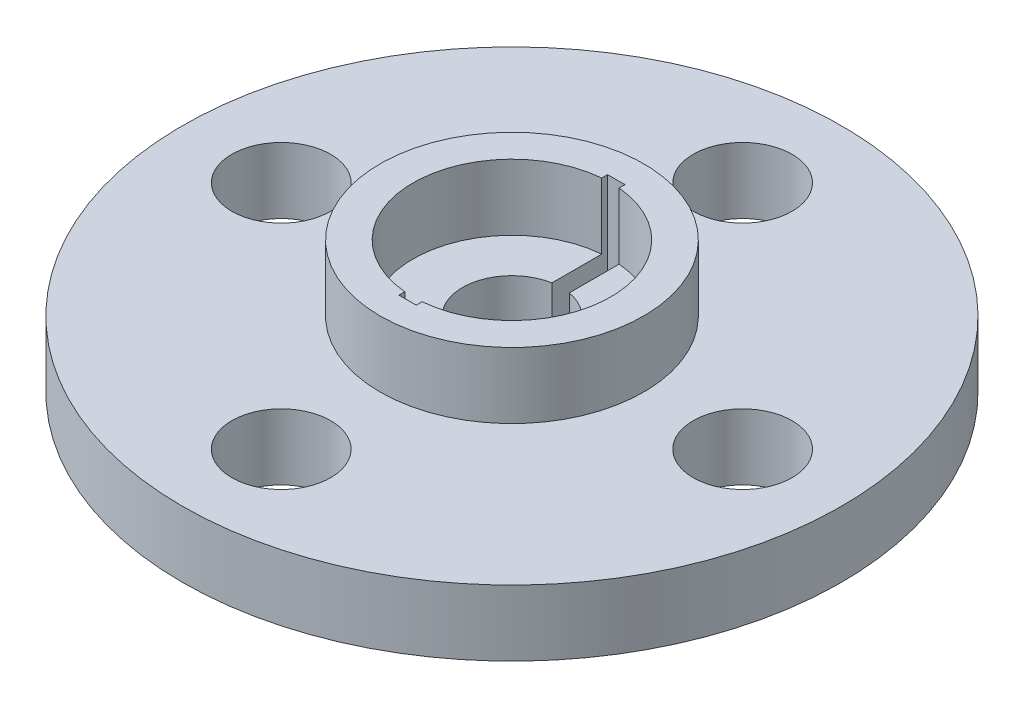
ISO-10303-21;
HEADER;
FILE_DESCRIPTION(('STEP AP214'),'2;1');
FILE_NAME('part.step','',(''),(''),'','','');
FILE_SCHEMA(('AUTOMOTIVE_DESIGN { 1 0 10303 214 1 1 1 1 }'));
ENDSEC;
DATA;
#1=APPLICATION_CONTEXT('core data for automotive mechanical design processes');
#2=APPLICATION_PROTOCOL_DEFINITION('international standard','automotive_design',2000,#1);
#3=PRODUCT_CONTEXT('',#1,'mechanical');
#4=PRODUCT('Part','Part','',(#3));
#5=PRODUCT_RELATED_PRODUCT_CATEGORY('part','',(#4));
#6=PRODUCT_DEFINITION_FORMATION('','',#4);
#7=PRODUCT_DEFINITION_CONTEXT('part definition',#1,'design');
#8=PRODUCT_DEFINITION('design','',#6,#7);
#9=PRODUCT_DEFINITION_SHAPE('','',#8);
#10=(LENGTH_UNIT() NAMED_UNIT(*) SI_UNIT(.MILLI.,.METRE.));
#11=(NAMED_UNIT(*) PLANE_ANGLE_UNIT() SI_UNIT($,.RADIAN.));
#12=(NAMED_UNIT(*) SI_UNIT($,.STERADIAN.) SOLID_ANGLE_UNIT());
#13=UNCERTAINTY_MEASURE_WITH_UNIT(LENGTH_MEASURE(1.E-05),#10,'distance_accuracy_value','');
#14=(GEOMETRIC_REPRESENTATION_CONTEXT(3) GLOBAL_UNCERTAINTY_ASSIGNED_CONTEXT((#13)) GLOBAL_UNIT_ASSIGNED_CONTEXT((#10,
#11,#12)) REPRESENTATION_CONTEXT('',''));
#15=CARTESIAN_POINT('',(0.,0.,0.));
#16=DIRECTION('',(0.,0.,1.));
#17=DIRECTION('',(1.,0.,0.));
#18=AXIS2_PLACEMENT_3D('',#15,#16,#17);
#19=CARTESIAN_POINT('',(0.,2.,0.));
#20=DIRECTION('',(0.,1.,0.));
#21=DIRECTION('',(0.,0.,1.));
#22=AXIS2_PLACEMENT_3D('',#19,#20,#21);
#23=PLANE('',#22);
#24=DIRECTION('',(0.,0.,-1.));
#25=VECTOR('',#24,1.);
#26=CARTESIAN_POINT('',(0.263212747721654,2.,0.));
#27=LINE('',#26,#25);
#28=CARTESIAN_POINT('',(0.263212747721654,2.,2.98843086743475));
#29=VERTEX_POINT('',#28);
#30=CARTESIAN_POINT('',(0.263212747721654,2.,1.47672578681244));
#31=VERTEX_POINT('',#30);
#32=EDGE_CURVE('E188',#29,#31,#27,.T.);
#33=ORIENTED_EDGE('',*,*,#32,.F.);
#34=CARTESIAN_POINT('',(0.,2.,0.));
#35=DIRECTION('',(0.,1.,0.));
#36=DIRECTION('',(0.,0.,1.));
#37=AXIS2_PLACEMENT_3D('',#34,#35,#36);
#38=CIRCLE('',#37,3.);
#39=CARTESIAN_POINT('',(0.263212747721654,2.,-2.98843086743475));
#40=VERTEX_POINT('',#39);
#41=EDGE_CURVE('E236',#40,#29,#38,.F.);
#42=ORIENTED_EDGE('',*,*,#41,.F.);
#43=CARTESIAN_POINT('',(0.263212747721654,2.,-1.47672578681244));
#44=VERTEX_POINT('',#43);
#45=EDGE_CURVE('E185',#44,#40,#27,.T.);
#46=ORIENTED_EDGE('',*,*,#45,.F.);
#47=CARTESIAN_POINT('',(0.,2.,0.));
#48=DIRECTION('',(0.,1.,0.));
#49=DIRECTION('',(0.,0.,1.));
#50=AXIS2_PLACEMENT_3D('',#47,#48,#49);
#51=CIRCLE('',#50,1.5);
#52=EDGE_CURVE('E219',#31,#44,#51,.T.);
#53=ORIENTED_EDGE('',*,*,#52,.F.);
#54=EDGE_LOOP('',(#33,#42,#46,#53));
#55=FACE_BOUND('',#54,.T.);
#56=ADVANCED_FACE('F42',(#55),#23,.T.);
#57=CARTESIAN_POINT('',(0.,2.,0.));
#58=DIRECTION('',(0.,-1.,0.));
#59=DIRECTION('',(0.,0.,-1.));
#60=AXIS2_PLACEMENT_3D('',#57,#58,#59);
#61=CYLINDRICAL_SURFACE('',#60,1.5);
#62=DIRECTION('',(0.,-1.,0.));
#63=VECTOR('',#62,1.);
#64=CARTESIAN_POINT('',(0.263212747721654,2.,1.47672578681244));
#65=LINE('',#64,#63);
#66=CARTESIAN_POINT('',(0.263212747721654,0.,1.47672578681244));
#67=VERTEX_POINT('',#66);
#68=EDGE_CURVE('E190',#31,#67,#65,.T.);
#69=ORIENTED_EDGE('',*,*,#68,.F.);
#70=ORIENTED_EDGE('',*,*,#52,.T.);
#71=DIRECTION('',(0.,-1.,0.));
#72=VECTOR('',#71,1.);
#73=CARTESIAN_POINT('',(0.263212747721654,2.,-1.47672578681244));
#74=LINE('',#73,#72);
#75=CARTESIAN_POINT('',(0.263212747721654,0.,-1.47672578681244));
#76=VERTEX_POINT('',#75);
#77=EDGE_CURVE('E187',#76,#44,#74,.F.);
#78=ORIENTED_EDGE('',*,*,#77,.F.);
#79=CARTESIAN_POINT('',(0.,0.,0.));
#80=DIRECTION('',(0.,1.,0.));
#81=DIRECTION('',(0.,0.,1.));
#82=AXIS2_PLACEMENT_3D('',#79,#80,#81);
#83=CIRCLE('',#82,1.5);
#84=EDGE_CURVE('E224',#67,#76,#83,.T.);
#85=ORIENTED_EDGE('',*,*,#84,.F.);
#86=EDGE_LOOP('',(#69,#70,#78,#85));
#87=FACE_BOUND('',#86,.T.);
#88=ADVANCED_FACE('F261',(#87),#61,.F.);
#89=CARTESIAN_POINT('',(0.,4.,0.));
#90=DIRECTION('',(0.,-1.,0.));
#91=DIRECTION('',(0.,0.,-1.));
#92=AXIS2_PLACEMENT_3D('',#89,#90,#91);
#93=CYLINDRICAL_SURFACE('',#92,3.);
#94=DIRECTION('',(0.,-1.,0.));
#95=VECTOR('',#94,1.);
#96=CARTESIAN_POINT('',(0.263212747721654,4.,2.98843086743475));
#97=LINE('',#96,#95);
#98=CARTESIAN_POINT('',(0.263212747721654,4.,2.98843086743475));
#99=VERTEX_POINT('',#98);
#100=EDGE_CURVE('E11',#99,#29,#97,.T.);
#101=ORIENTED_EDGE('',*,*,#100,.F.);
#102=CARTESIAN_POINT('',(0.,4.,0.));
#103=DIRECTION('',(0.,1.,0.));
#104=DIRECTION('',(0.,0.,1.));
#105=AXIS2_PLACEMENT_3D('',#102,#103,#104);
#106=CIRCLE('',#105,3.);
#107=CARTESIAN_POINT('',(0.263212747721654,4.,-2.98843086743475));
#108=VERTEX_POINT('',#107);
#109=EDGE_CURVE('E156',#99,#108,#106,.T.);
#110=ORIENTED_EDGE('',*,*,#109,.T.);
#111=DIRECTION('',(0.,-1.,0.));
#112=VECTOR('',#111,1.);
#113=CARTESIAN_POINT('',(0.263212747721654,4.,-2.98843086743475));
#114=LINE('',#113,#112);
#115=EDGE_CURVE('E50',#40,#108,#114,.F.);
#116=ORIENTED_EDGE('',*,*,#115,.F.);
#117=ORIENTED_EDGE('',*,*,#41,.T.);
#118=EDGE_LOOP('',(#101,#110,#116,#117));
#119=FACE_BOUND('',#118,.T.);
#120=ADVANCED_FACE('F254',(#119),#93,.F.);
#121=DIRECTION('',(0.,0.,1.));
#122=VECTOR('',#121,1.);
#123=CARTESIAN_POINT('',(-0.263212747721654,2.,0.));
#124=LINE('',#123,#122);
#125=CARTESIAN_POINT('',(-0.263212747721654,2.,-2.98843086743475));
#126=VERTEX_POINT('',#125);
#127=CARTESIAN_POINT('',(-0.263212747721654,2.,-1.47672578681244));
#128=VERTEX_POINT('',#127);
#129=EDGE_CURVE('E181',#126,#128,#124,.T.);
#130=ORIENTED_EDGE('',*,*,#129,.F.);
#131=CARTESIAN_POINT('',(-0.263212747721654,2.,2.98843086743475));
#132=VERTEX_POINT('',#131);
#133=EDGE_CURVE('E239',#132,#126,#38,.F.);
#134=ORIENTED_EDGE('',*,*,#133,.F.);
#135=CARTESIAN_POINT('',(-0.263212747721654,2.,1.47672578681244));
#136=VERTEX_POINT('',#135);
#137=EDGE_CURVE('E57',#136,#132,#124,.T.);
#138=ORIENTED_EDGE('',*,*,#137,.F.);
#139=EDGE_CURVE('E223',#128,#136,#51,.T.);
#140=ORIENTED_EDGE('',*,*,#139,.F.);
#141=EDGE_LOOP('',(#130,#134,#138,#140));
#142=FACE_BOUND('',#141,.T.);
#143=ADVANCED_FACE('F280',(#142),#23,.T.);
#144=CARTESIAN_POINT('',(0.,2.,0.));
#145=DIRECTION('',(0.,1.,0.));
#146=DIRECTION('',(0.,0.,1.));
#147=AXIS2_PLACEMENT_3D('',#144,#145,#146);
#148=CIRCLE('',#147,4.);
#149=CARTESIAN_POINT('',(0.,2.,4.));
#150=VERTEX_POINT('',#149);
#151=EDGE_CURVE('E194',#150,#150,#148,.T.);
#152=ORIENTED_EDGE('',*,*,#151,.F.);
#153=EDGE_LOOP('',(#152));
#154=FACE_BOUND('',#153,.T.);
#155=CARTESIAN_POINT('',(-7.,2.,0.));
#156=DIRECTION('',(0.,1.,0.));
#157=DIRECTION('',(0.,0.,1.));
#158=AXIS2_PLACEMENT_3D('',#155,#156,#157);
#159=CIRCLE('',#158,1.5);
#160=CARTESIAN_POINT('',(-7.,2.,1.49999999999995));
#161=VERTEX_POINT('',#160);
#162=EDGE_CURVE('E207',#161,#161,#159,.T.);
#163=ORIENTED_EDGE('',*,*,#162,.F.);
#164=EDGE_LOOP('',(#163));
#165=FACE_BOUND('',#164,.T.);
#166=CARTESIAN_POINT('',(0.,2.,0.));
#167=DIRECTION('',(0.,1.,0.));
#168=DIRECTION('',(0.,0.,1.));
#169=AXIS2_PLACEMENT_3D('',#166,#167,#168);
#170=CIRCLE('',#169,10.);
#171=CARTESIAN_POINT('',(0.,2.,10.));
#172=VERTEX_POINT('',#171);
#173=EDGE_CURVE('E233',#172,#172,#170,.T.);
#174=ORIENTED_EDGE('',*,*,#173,.T.);
#175=EDGE_LOOP('',(#174));
#176=FACE_BOUND('',#175,.T.);
#177=CARTESIAN_POINT('',(7.,2.,0.));
#178=DIRECTION('',(0.,1.,0.));
#179=DIRECTION('',(0.,0.,1.));
#180=AXIS2_PLACEMENT_3D('',#177,#178,#179);
#181=CIRCLE('',#180,1.5);
#182=CARTESIAN_POINT('',(7.,2.,1.5));
#183=VERTEX_POINT('',#182);
#184=EDGE_CURVE('E227',#183,#183,#181,.T.);
#185=ORIENTED_EDGE('',*,*,#184,.F.);
#186=EDGE_LOOP('',(#185));
#187=FACE_BOUND('',#186,.T.);
#188=CARTESIAN_POINT('',(0.,2.,7.));
#189=DIRECTION('',(0.,1.,0.));
#190=DIRECTION('',(0.,0.,1.));
#191=AXIS2_PLACEMENT_3D('',#188,#189,#190);
#192=CIRCLE('',#191,1.5);
#193=CARTESIAN_POINT('',(0.,2.,8.5));
#194=VERTEX_POINT('',#193);
#195=EDGE_CURVE('E213',#194,#194,#192,.T.);
#196=ORIENTED_EDGE('',*,*,#195,.F.);
#197=EDGE_LOOP('',(#196));
#198=FACE_BOUND('',#197,.T.);
#199=CARTESIAN_POINT('',(0.,2.,-7.));
#200=DIRECTION('',(0.,1.,0.));
#201=DIRECTION('',(0.,0.,1.));
#202=AXIS2_PLACEMENT_3D('',#199,#200,#201);
#203=CIRCLE('',#202,1.5);
#204=CARTESIAN_POINT('',(0.,2.,-5.5));
#205=VERTEX_POINT('',#204);
#206=EDGE_CURVE('E201',#205,#205,#203,.T.);
#207=ORIENTED_EDGE('',*,*,#206,.F.);
#208=EDGE_LOOP('',(#207));
#209=FACE_BOUND('',#208,.T.);
#210=ADVANCED_FACE('F299',(#154,#165,#176,#187,#198,#209),#23,.T.);
#211=CARTESIAN_POINT('',(0.,0.,0.));
#212=DIRECTION('',(0.,1.,0.));
#213=DIRECTION('',(0.,0.,1.));
#214=AXIS2_PLACEMENT_3D('',#211,#212,#213);
#215=PLANE('',#214);
#216=CARTESIAN_POINT('',(0.,0.,0.));
#217=DIRECTION('',(0.,1.,0.));
#218=DIRECTION('',(0.,0.,1.));
#219=AXIS2_PLACEMENT_3D('',#216,#217,#218);
#220=CIRCLE('',#219,10.);
#221=CARTESIAN_POINT('',(0.,0.,10.));
#222=VERTEX_POINT('',#221);
#223=EDGE_CURVE('E230',#222,#222,#220,.T.);
#224=ORIENTED_EDGE('',*,*,#223,.F.);
#225=EDGE_LOOP('',(#224));
#226=FACE_BOUND('',#225,.T.);
#227=CARTESIAN_POINT('',(7.,0.,0.));
#228=DIRECTION('',(0.,1.,0.));
#229=DIRECTION('',(0.,0.,1.));
#230=AXIS2_PLACEMENT_3D('',#227,#228,#229);
#231=CIRCLE('',#230,1.5);
#232=CARTESIAN_POINT('',(7.,0.,1.5));
#233=VERTEX_POINT('',#232);
#234=EDGE_CURVE('E222',#233,#233,#231,.T.);
#235=ORIENTED_EDGE('',*,*,#234,.T.);
#236=EDGE_LOOP('',(#235));
#237=FACE_BOUND('',#236,.T.);
#238=ORIENTED_EDGE('',*,*,#84,.T.);
#239=DIRECTION('',(0.,0.,1.));
#240=VECTOR('',#239,1.);
#241=CARTESIAN_POINT('',(0.263212747721654,0.,-3.16646059226798));
#242=LINE('',#241,#240);
#243=CARTESIAN_POINT('',(0.263212747721654,0.,-3.16646059226798));
#244=VERTEX_POINT('',#243);
#245=EDGE_CURVE('E167',#244,#76,#242,.T.);
#246=ORIENTED_EDGE('',*,*,#245,.F.);
#247=DIRECTION('',(1.,0.,0.));
#248=VECTOR('',#247,1.);
#249=CARTESIAN_POINT('',(-0.263212747721654,0.,-3.16646059226798));
#250=LINE('',#249,#248);
#251=CARTESIAN_POINT('',(-0.263212747721654,0.,-3.16646059226798));
#252=VERTEX_POINT('',#251);
#253=EDGE_CURVE('E157',#252,#244,#250,.T.);
#254=ORIENTED_EDGE('',*,*,#253,.F.);
#255=DIRECTION('',(0.,0.,-1.));
#256=VECTOR('',#255,1.);
#257=CARTESIAN_POINT('',(-0.263212747721654,0.,-3.16646059226798));
#258=LINE('',#257,#256);
#259=CARTESIAN_POINT('',(-0.263212747721654,0.,-1.47672578681244));
#260=VERTEX_POINT('',#259);
#261=EDGE_CURVE('E171',#260,#252,#258,.T.);
#262=ORIENTED_EDGE('',*,*,#261,.F.);
#263=CARTESIAN_POINT('',(-0.263212747721654,0.,1.47672578681244));
#264=VERTEX_POINT('',#263);
#265=EDGE_CURVE('E216',#260,#264,#83,.T.);
#266=ORIENTED_EDGE('',*,*,#265,.T.);
#267=CARTESIAN_POINT('',(-0.263212747721654,0.,3.16646059226798));
#268=VERTEX_POINT('',#267);
#269=EDGE_CURVE('E160',#268,#264,#258,.T.);
#270=ORIENTED_EDGE('',*,*,#269,.F.);
#271=DIRECTION('',(-1.,0.,0.));
#272=VECTOR('',#271,1.);
#273=CARTESIAN_POINT('',(-0.263212747721654,0.,3.16646059226798));
#274=LINE('',#273,#272);
#275=CARTESIAN_POINT('',(0.263212747721654,0.,3.16646059226798));
#276=VERTEX_POINT('',#275);
#277=EDGE_CURVE('E169',#276,#268,#274,.T.);
#278=ORIENTED_EDGE('',*,*,#277,.F.);
#279=EDGE_CURVE('E136',#67,#276,#242,.T.);
#280=ORIENTED_EDGE('',*,*,#279,.F.);
#281=EDGE_LOOP('',(#238,#246,#254,#262,#266,#270,#278,#280));
#282=FACE_BOUND('',#281,.T.);
#283=CARTESIAN_POINT('',(0.,0.,7.));
#284=DIRECTION('',(0.,1.,0.));
#285=DIRECTION('',(0.,0.,1.));
#286=AXIS2_PLACEMENT_3D('',#283,#284,#285);
#287=CIRCLE('',#286,1.5);
#288=CARTESIAN_POINT('',(0.,0.,8.5));
#289=VERTEX_POINT('',#288);
#290=EDGE_CURVE('E210',#289,#289,#287,.T.);
#291=ORIENTED_EDGE('',*,*,#290,.T.);
#292=EDGE_LOOP('',(#291));
#293=FACE_BOUND('',#292,.T.);
#294=CARTESIAN_POINT('',(-7.,0.,0.));
#295=DIRECTION('',(0.,1.,0.));
#296=DIRECTION('',(0.,0.,1.));
#297=AXIS2_PLACEMENT_3D('',#294,#295,#296);
#298=CIRCLE('',#297,1.5);
#299=CARTESIAN_POINT('',(-7.,0.,1.49999999999995));
#300=VERTEX_POINT('',#299);
#301=EDGE_CURVE('E204',#300,#300,#298,.T.);
#302=ORIENTED_EDGE('',*,*,#301,.T.);
#303=EDGE_LOOP('',(#302));
#304=FACE_BOUND('',#303,.T.);
#305=CARTESIAN_POINT('',(0.,0.,-7.));
#306=DIRECTION('',(0.,1.,0.));
#307=DIRECTION('',(0.,0.,1.));
#308=AXIS2_PLACEMENT_3D('',#305,#306,#307);
#309=CIRCLE('',#308,1.5);
#310=CARTESIAN_POINT('',(0.,0.,-5.5));
#311=VERTEX_POINT('',#310);
#312=EDGE_CURVE('E198',#311,#311,#309,.T.);
#313=ORIENTED_EDGE('',*,*,#312,.T.);
#314=EDGE_LOOP('',(#313));
#315=FACE_BOUND('',#314,.T.);
#316=ADVANCED_FACE('F264',(#226,#237,#282,#293,#304,#315),#215,.F.);
#317=CARTESIAN_POINT('',(0.,2.,0.));
#318=DIRECTION('',(0.,-1.,0.));
#319=DIRECTION('',(0.,0.,-1.));
#320=AXIS2_PLACEMENT_3D('',#317,#318,#319);
#321=CYLINDRICAL_SURFACE('',#320,10.);
#322=ORIENTED_EDGE('',*,*,#173,.F.);
#323=EDGE_LOOP('',(#322));
#324=FACE_BOUND('',#323,.T.);
#325=ORIENTED_EDGE('',*,*,#223,.T.);
#326=EDGE_LOOP('',(#325));
#327=FACE_BOUND('',#326,.T.);
#328=ADVANCED_FACE('F44',(#324,#327),#321,.T.);
#329=CARTESIAN_POINT('',(7.,2.,0.));
#330=DIRECTION('',(0.,-1.,0.));
#331=DIRECTION('',(0.,0.,-1.));
#332=AXIS2_PLACEMENT_3D('',#329,#330,#331);
#333=CYLINDRICAL_SURFACE('',#332,1.5);
#334=ORIENTED_EDGE('',*,*,#184,.T.);
#335=EDGE_LOOP('',(#334));
#336=FACE_BOUND('',#335,.T.);
#337=ORIENTED_EDGE('',*,*,#234,.F.);
#338=EDGE_LOOP('',(#337));
#339=FACE_BOUND('',#338,.T.);
#340=ADVANCED_FACE('F349',(#336,#339),#333,.F.);
#341=DIRECTION('',(0.,-1.,0.));
#342=VECTOR('',#341,1.);
#343=CARTESIAN_POINT('',(-0.263212747721654,2.,-1.47672578681244));
#344=LINE('',#343,#342);
#345=EDGE_CURVE('E183',#128,#260,#344,.T.);
#346=ORIENTED_EDGE('',*,*,#345,.F.);
#347=ORIENTED_EDGE('',*,*,#139,.T.);
#348=DIRECTION('',(0.,-1.,0.));
#349=VECTOR('',#348,1.);
#350=CARTESIAN_POINT('',(-0.263212747721654,2.,1.47672578681244));
#351=LINE('',#350,#349);
#352=EDGE_CURVE('E180',#264,#136,#351,.F.);
#353=ORIENTED_EDGE('',*,*,#352,.F.);
#354=ORIENTED_EDGE('',*,*,#265,.F.);
#355=EDGE_LOOP('',(#346,#347,#353,#354));
#356=FACE_BOUND('',#355,.T.);
#357=ADVANCED_FACE('F276',(#356),#61,.F.);
#358=CARTESIAN_POINT('',(0.,2.,7.));
#359=DIRECTION('',(0.,-1.,0.));
#360=DIRECTION('',(0.,0.,-1.));
#361=AXIS2_PLACEMENT_3D('',#358,#359,#360);
#362=CYLINDRICAL_SURFACE('',#361,1.5);
#363=ORIENTED_EDGE('',*,*,#195,.T.);
#364=EDGE_LOOP('',(#363));
#365=FACE_BOUND('',#364,.T.);
#366=ORIENTED_EDGE('',*,*,#290,.F.);
#367=EDGE_LOOP('',(#366));
#368=FACE_BOUND('',#367,.T.);
#369=ADVANCED_FACE('F341',(#365,#368),#362,.F.);
#370=CARTESIAN_POINT('',(-7.,2.,0.));
#371=DIRECTION('',(0.,-1.,0.));
#372=DIRECTION('',(0.,0.,-1.));
#373=AXIS2_PLACEMENT_3D('',#370,#371,#372);
#374=CYLINDRICAL_SURFACE('',#373,1.5);
#375=ORIENTED_EDGE('',*,*,#162,.T.);
#376=EDGE_LOOP('',(#375));
#377=FACE_BOUND('',#376,.T.);
#378=ORIENTED_EDGE('',*,*,#301,.F.);
#379=EDGE_LOOP('',(#378));
#380=FACE_BOUND('',#379,.T.);
#381=ADVANCED_FACE('F330',(#377,#380),#374,.F.);
#382=CARTESIAN_POINT('',(0.,2.,-7.));
#383=DIRECTION('',(0.,-1.,0.));
#384=DIRECTION('',(0.,0.,-1.));
#385=AXIS2_PLACEMENT_3D('',#382,#383,#384);
#386=CYLINDRICAL_SURFACE('',#385,1.5);
#387=ORIENTED_EDGE('',*,*,#206,.T.);
#388=EDGE_LOOP('',(#387));
#389=FACE_BOUND('',#388,.T.);
#390=ORIENTED_EDGE('',*,*,#312,.F.);
#391=EDGE_LOOP('',(#390));
#392=FACE_BOUND('',#391,.T.);
#393=ADVANCED_FACE('F327',(#389,#392),#386,.F.);
#394=CARTESIAN_POINT('',(0.,4.,0.));
#395=DIRECTION('',(0.,1.,0.));
#396=DIRECTION('',(0.,0.,1.));
#397=AXIS2_PLACEMENT_3D('',#394,#395,#396);
#398=PLANE('',#397);
#399=DIRECTION('',(0.,0.,1.));
#400=VECTOR('',#399,1.);
#401=CARTESIAN_POINT('',(0.263212747721654,4.,-3.16646059226798));
#402=LINE('',#401,#400);
#403=CARTESIAN_POINT('',(0.263212747721654,4.,-3.16646059226798));
#404=VERTEX_POINT('',#403);
#405=EDGE_CURVE('E149',#404,#108,#402,.T.);
#406=ORIENTED_EDGE('',*,*,#405,.T.);
#407=ORIENTED_EDGE('',*,*,#109,.F.);
#408=CARTESIAN_POINT('',(0.263212747721654,4.,3.16646059226798));
#409=VERTEX_POINT('',#408);
#410=EDGE_CURVE('E133',#99,#409,#402,.T.);
#411=ORIENTED_EDGE('',*,*,#410,.T.);
#412=DIRECTION('',(-1.,0.,0.));
#413=VECTOR('',#412,1.);
#414=CARTESIAN_POINT('',(-0.263212747721654,4.,3.16646059226798));
#415=LINE('',#414,#413);
#416=CARTESIAN_POINT('',(-0.263212747721654,4.,3.16646059226798));
#417=VERTEX_POINT('',#416);
#418=EDGE_CURVE('E144',#409,#417,#415,.T.);
#419=ORIENTED_EDGE('',*,*,#418,.T.);
#420=DIRECTION('',(0.,0.,-1.));
#421=VECTOR('',#420,1.);
#422=CARTESIAN_POINT('',(-0.263212747721654,4.,-3.16646059226798));
#423=LINE('',#422,#421);
#424=CARTESIAN_POINT('',(-0.263212747721654,4.,2.98843086743475));
#425=VERTEX_POINT('',#424);
#426=EDGE_CURVE('E163',#417,#425,#423,.T.);
#427=ORIENTED_EDGE('',*,*,#426,.T.);
#428=CARTESIAN_POINT('',(-0.263212747721654,4.,-2.98843086743475));
#429=VERTEX_POINT('',#428);
#430=EDGE_CURVE('E192',#429,#425,#106,.T.);
#431=ORIENTED_EDGE('',*,*,#430,.F.);
#432=CARTESIAN_POINT('',(-0.263212747721654,4.,-3.16646059226798));
#433=VERTEX_POINT('',#432);
#434=EDGE_CURVE('E65',#429,#433,#423,.T.);
#435=ORIENTED_EDGE('',*,*,#434,.T.);
#436=DIRECTION('',(1.,0.,0.));
#437=VECTOR('',#436,1.);
#438=CARTESIAN_POINT('',(-0.263212747721654,4.,-3.16646059226798));
#439=LINE('',#438,#437);
#440=EDGE_CURVE('E141',#433,#404,#439,.T.);
#441=ORIENTED_EDGE('',*,*,#440,.T.);
#442=EDGE_LOOP('',(#406,#407,#411,#419,#427,#431,#435,#441));
#443=FACE_BOUND('',#442,.T.);
#444=CARTESIAN_POINT('',(0.,4.,0.));
#445=DIRECTION('',(0.,1.,0.));
#446=DIRECTION('',(0.,0.,1.));
#447=AXIS2_PLACEMENT_3D('',#444,#445,#446);
#448=CIRCLE('',#447,4.);
#449=CARTESIAN_POINT('',(0.,4.,4.));
#450=VERTEX_POINT('',#449);
#451=EDGE_CURVE('E195',#450,#450,#448,.T.);
#452=ORIENTED_EDGE('',*,*,#451,.T.);
#453=EDGE_LOOP('',(#452));
#454=FACE_BOUND('',#453,.T.);
#455=ADVANCED_FACE('F153',(#443,#454),#398,.T.);
#456=CARTESIAN_POINT('',(0.,4.,0.));
#457=DIRECTION('',(0.,-1.,0.));
#458=DIRECTION('',(0.,0.,-1.));
#459=AXIS2_PLACEMENT_3D('',#456,#457,#458);
#460=CYLINDRICAL_SURFACE('',#459,4.);
#461=ORIENTED_EDGE('',*,*,#451,.F.);
#462=EDGE_LOOP('',(#461));
#463=FACE_BOUND('',#462,.T.);
#464=ORIENTED_EDGE('',*,*,#151,.T.);
#465=EDGE_LOOP('',(#464));
#466=FACE_BOUND('',#465,.T.);
#467=ADVANCED_FACE('F339',(#463,#466),#460,.T.);
#468=DIRECTION('',(0.,-1.,0.));
#469=VECTOR('',#468,1.);
#470=CARTESIAN_POINT('',(-0.263212747721654,4.,-2.98843086743475));
#471=LINE('',#470,#469);
#472=EDGE_CURVE('E244',#429,#126,#471,.T.);
#473=ORIENTED_EDGE('',*,*,#472,.F.);
#474=ORIENTED_EDGE('',*,*,#430,.T.);
#475=DIRECTION('',(0.,-1.,0.));
#476=VECTOR('',#475,1.);
#477=CARTESIAN_POINT('',(-0.263212747721654,4.,2.98843086743475));
#478=LINE('',#477,#476);
#479=EDGE_CURVE('E242',#132,#425,#478,.F.);
#480=ORIENTED_EDGE('',*,*,#479,.F.);
#481=ORIENTED_EDGE('',*,*,#133,.T.);
#482=EDGE_LOOP('',(#473,#474,#480,#481));
#483=FACE_BOUND('',#482,.T.);
#484=ADVANCED_FACE('F283',(#483),#93,.F.);
#485=CARTESIAN_POINT('',(-0.263212747721654,4.,-3.16646059226798));
#486=DIRECTION('',(-1.,0.,0.));
#487=DIRECTION('',(0.,0.,1.));
#488=AXIS2_PLACEMENT_3D('',#485,#486,#487);
#489=PLANE('',#488);
#490=ORIENTED_EDGE('',*,*,#352,.T.);
#491=ORIENTED_EDGE('',*,*,#137,.T.);
#492=ORIENTED_EDGE('',*,*,#479,.T.);
#493=ORIENTED_EDGE('',*,*,#426,.F.);
#494=DIRECTION('',(0.,-1.,0.));
#495=VECTOR('',#494,1.);
#496=CARTESIAN_POINT('',(-0.263212747721654,4.,3.16646059226798));
#497=LINE('',#496,#495);
#498=EDGE_CURVE('E140',#417,#268,#497,.T.);
#499=ORIENTED_EDGE('',*,*,#498,.T.);
#500=ORIENTED_EDGE('',*,*,#269,.T.);
#501=EDGE_LOOP('',(#490,#491,#492,#493,#499,#500));
#502=FACE_BOUND('',#501,.T.);
#503=ADVANCED_FACE('F272',(#502),#489,.F.);
#504=CARTESIAN_POINT('',(0.263212747721654,4.,-3.16646059226798));
#505=DIRECTION('',(1.,0.,0.));
#506=DIRECTION('',(0.,0.,-1.));
#507=AXIS2_PLACEMENT_3D('',#504,#505,#506);
#508=PLANE('',#507);
#509=ORIENTED_EDGE('',*,*,#68,.T.);
#510=ORIENTED_EDGE('',*,*,#279,.T.);
#511=DIRECTION('',(0.,-1.,0.));
#512=VECTOR('',#511,1.);
#513=CARTESIAN_POINT('',(0.263212747721654,4.,3.16646059226798));
#514=LINE('',#513,#512);
#515=EDGE_CURVE('E129',#409,#276,#514,.T.);
#516=ORIENTED_EDGE('',*,*,#515,.F.);
#517=ORIENTED_EDGE('',*,*,#410,.F.);
#518=ORIENTED_EDGE('',*,*,#100,.T.);
#519=ORIENTED_EDGE('',*,*,#32,.T.);
#520=EDGE_LOOP('',(#509,#510,#516,#517,#518,#519));
#521=FACE_BOUND('',#520,.T.);
#522=ADVANCED_FACE('F131',(#521),#508,.F.);
#523=CARTESIAN_POINT('',(-0.263212747721654,4.,3.16646059226798));
#524=DIRECTION('',(0.,0.,1.));
#525=DIRECTION('',(1.,0.,0.));
#526=AXIS2_PLACEMENT_3D('',#523,#524,#525);
#527=PLANE('',#526);
#528=ORIENTED_EDGE('',*,*,#277,.T.);
#529=ORIENTED_EDGE('',*,*,#498,.F.);
#530=ORIENTED_EDGE('',*,*,#418,.F.);
#531=ORIENTED_EDGE('',*,*,#515,.T.);
#532=EDGE_LOOP('',(#528,#529,#530,#531));
#533=FACE_BOUND('',#532,.T.);
#534=ADVANCED_FACE('F145',(#533),#527,.F.);
#535=ORIENTED_EDGE('',*,*,#345,.T.);
#536=ORIENTED_EDGE('',*,*,#261,.T.);
#537=DIRECTION('',(0.,-1.,0.));
#538=VECTOR('',#537,1.);
#539=CARTESIAN_POINT('',(-0.263212747721654,4.,-3.16646059226798));
#540=LINE('',#539,#538);
#541=EDGE_CURVE('E175',#433,#252,#540,.T.);
#542=ORIENTED_EDGE('',*,*,#541,.F.);
#543=ORIENTED_EDGE('',*,*,#434,.F.);
#544=ORIENTED_EDGE('',*,*,#472,.T.);
#545=ORIENTED_EDGE('',*,*,#129,.T.);
#546=EDGE_LOOP('',(#535,#536,#542,#543,#544,#545));
#547=FACE_BOUND('',#546,.T.);
#548=ADVANCED_FACE('F286',(#547),#489,.F.);
#549=ORIENTED_EDGE('',*,*,#77,.T.);
#550=ORIENTED_EDGE('',*,*,#45,.T.);
#551=ORIENTED_EDGE('',*,*,#115,.T.);
#552=ORIENTED_EDGE('',*,*,#405,.F.);
#553=DIRECTION('',(0.,-1.,0.));
#554=VECTOR('',#553,1.);
#555=CARTESIAN_POINT('',(0.263212747721654,4.,-3.16646059226798));
#556=LINE('',#555,#554);
#557=EDGE_CURVE('E173',#404,#244,#556,.T.);
#558=ORIENTED_EDGE('',*,*,#557,.T.);
#559=ORIENTED_EDGE('',*,*,#245,.T.);
#560=EDGE_LOOP('',(#549,#550,#551,#552,#558,#559));
#561=FACE_BOUND('',#560,.T.);
#562=ADVANCED_FACE('F248',(#561),#508,.F.);
#563=CARTESIAN_POINT('',(-0.263212747721654,4.,-3.16646059226798));
#564=DIRECTION('',(0.,0.,-1.));
#565=DIRECTION('',(-1.,0.,0.));
#566=AXIS2_PLACEMENT_3D('',#563,#564,#565);
#567=PLANE('',#566);
#568=ORIENTED_EDGE('',*,*,#253,.T.);
#569=ORIENTED_EDGE('',*,*,#557,.F.);
#570=ORIENTED_EDGE('',*,*,#440,.F.);
#571=ORIENTED_EDGE('',*,*,#541,.T.);
#572=EDGE_LOOP('',(#568,#569,#570,#571));
#573=FACE_BOUND('',#572,.T.);
#574=ADVANCED_FACE('F289',(#573),#567,.F.);
#575=CLOSED_SHELL('',(#56,#88,#120,#143,#210,#316,#328,#340,#357,#369,#381,#393,#455,#467,#484,
#503,#522,#534,#548,#562,#574));
#576=MANIFOLD_SOLID_BREP('B2',#575);
#577=ADVANCED_BREP_SHAPE_REPRESENTATION('',(#18,#576),#14);
#578=SHAPE_DEFINITION_REPRESENTATION(#9,#577);
ENDSEC;
END-ISO-10303-21;
